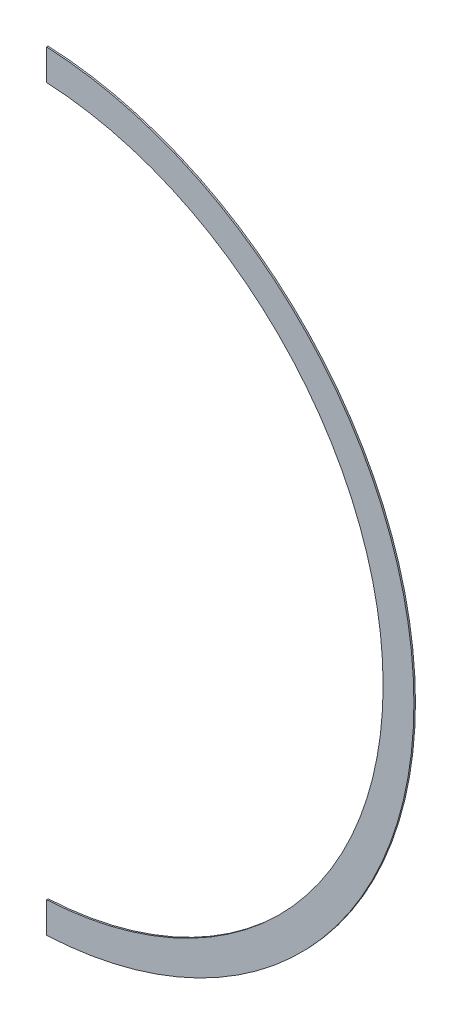
ISO-10303-21;
HEADER;
FILE_DESCRIPTION(('STEP AP214'),'2;1');
FILE_NAME('part.step','',(''),(''),'','','');
FILE_SCHEMA(('AUTOMOTIVE_DESIGN { 1 0 10303 214 1 1 1 1 }'));
ENDSEC;
DATA;
#1=APPLICATION_CONTEXT('core data for automotive mechanical design processes');
#2=APPLICATION_PROTOCOL_DEFINITION('international standard','automotive_design',2000,#1);
#3=PRODUCT_CONTEXT('',#1,'mechanical');
#4=PRODUCT('Part','Part','',(#3));
#5=PRODUCT_RELATED_PRODUCT_CATEGORY('part','',(#4));
#6=PRODUCT_DEFINITION_FORMATION('','',#4);
#7=PRODUCT_DEFINITION_CONTEXT('part definition',#1,'design');
#8=PRODUCT_DEFINITION('design','',#6,#7);
#9=PRODUCT_DEFINITION_SHAPE('','',#8);
#10=(LENGTH_UNIT() NAMED_UNIT(*) SI_UNIT(.MILLI.,.METRE.));
#11=(NAMED_UNIT(*) PLANE_ANGLE_UNIT() SI_UNIT($,.RADIAN.));
#12=(NAMED_UNIT(*) SI_UNIT($,.STERADIAN.) SOLID_ANGLE_UNIT());
#13=UNCERTAINTY_MEASURE_WITH_UNIT(LENGTH_MEASURE(1.E-05),#10,'distance_accuracy_value','');
#14=(GEOMETRIC_REPRESENTATION_CONTEXT(3) GLOBAL_UNCERTAINTY_ASSIGNED_CONTEXT((#13)) GLOBAL_UNIT_ASSIGNED_CONTEXT((#10,
#11,#12)) REPRESENTATION_CONTEXT('',''));
#15=CARTESIAN_POINT('',(0.,0.,0.));
#16=DIRECTION('',(0.,0.,1.));
#17=DIRECTION('',(1.,0.,0.));
#18=AXIS2_PLACEMENT_3D('',#15,#16,#17);
#19=CARTESIAN_POINT('',(0.25,-4.99374608885955,0.750000000000001));
#20=DIRECTION('',(0.,0.,-1.));
#21=DIRECTION('',(-1.,0.,0.));
#22=AXIS2_PLACEMENT_3D('',#19,#20,#21);
#23=CYLINDRICAL_SURFACE('',#22,345.);
#24=CARTESIAN_POINT('',(0.25,-4.99374608885955,-0.749999999999992));
#25=DIRECTION('',(0.,0.,-1.));
#26=DIRECTION('',(1.,0.,0.));
#27=AXIS2_PLACEMENT_3D('',#24,#25,#26);
#28=CIRCLE('',#27,345.);
#29=CARTESIAN_POINT('',(17.5000000000001,339.574734042449,-0.750000000000001));
#30=VERTEX_POINT('',#29);
#31=CARTESIAN_POINT('',(17.5,-349.562226220168,-0.749999999999995));
#32=VERTEX_POINT('',#31);
#33=EDGE_CURVE('E104',#30,#32,#28,.T.);
#34=ORIENTED_EDGE('',*,*,#33,.T.);
#35=DIRECTION('',(0.,0.,-1.));
#36=VECTOR('',#35,1.);
#37=CARTESIAN_POINT('',(17.5000000000001,-349.562226220168,0.749999999999997));
#38=LINE('',#37,#36);
#39=CARTESIAN_POINT('',(17.5000000000001,-349.562226220168,0.749999999999997));
#40=VERTEX_POINT('',#39);
#41=EDGE_CURVE('E11',#40,#32,#38,.T.);
#42=ORIENTED_EDGE('',*,*,#41,.F.);
#43=CARTESIAN_POINT('',(0.25,-4.99374608885955,0.750000000000001));
#44=DIRECTION('',(0.,0.,-1.));
#45=DIRECTION('',(1.,0.,0.));
#46=AXIS2_PLACEMENT_3D('',#43,#44,#45);
#47=CIRCLE('',#46,345.);
#48=CARTESIAN_POINT('',(17.5000000000001,339.574734042449,0.750000000000022));
#49=VERTEX_POINT('',#48);
#50=EDGE_CURVE('E87',#49,#40,#47,.T.);
#51=ORIENTED_EDGE('',*,*,#50,.F.);
#52=DIRECTION('',(0.,0.,-1.));
#53=VECTOR('',#52,1.);
#54=CARTESIAN_POINT('',(17.5000000000001,339.574734042449,0.750000000000022));
#55=LINE('',#54,#53);
#56=EDGE_CURVE('E100',#49,#30,#55,.T.);
#57=ORIENTED_EDGE('',*,*,#56,.T.);
#58=EDGE_LOOP('',(#34,#42,#51,#57));
#59=FACE_BOUND('',#58,.T.);
#60=ADVANCED_FACE('F35',(#59),#23,.F.);
#61=CARTESIAN_POINT('',(17.5,-379.596825592627,0.750000000000004));
#62=DIRECTION('',(1.,0.,0.));
#63=DIRECTION('',(0.,0.,-1.));
#64=AXIS2_PLACEMENT_3D('',#61,#62,#63);
#65=PLANE('',#64);
#66=DIRECTION('',(0.,-0.999999999999999,0.));
#67=VECTOR('',#66,1.);
#68=CARTESIAN_POINT('',(17.5,-379.596825592627,-0.750000000000001));
#69=LINE('',#68,#67);
#70=CARTESIAN_POINT('',(17.5,-379.596825592627,-0.750000000000001));
#71=VERTEX_POINT('',#70);
#72=EDGE_CURVE('E92',#32,#71,#69,.T.);
#73=ORIENTED_EDGE('',*,*,#72,.T.);
#74=DIRECTION('',(0.,0.,-1.));
#75=VECTOR('',#74,1.);
#76=CARTESIAN_POINT('',(17.5,-379.596825592627,0.750000000000004));
#77=LINE('',#76,#75);
#78=CARTESIAN_POINT('',(17.5,-379.596825592627,0.750000000000004));
#79=VERTEX_POINT('',#78);
#80=EDGE_CURVE('E44',#79,#71,#77,.T.);
#81=ORIENTED_EDGE('',*,*,#80,.F.);
#82=DIRECTION('',(0.,-0.999999999999999,0.));
#83=VECTOR('',#82,1.);
#84=CARTESIAN_POINT('',(17.5,-379.596825592627,0.750000000000004));
#85=LINE('',#84,#83);
#86=EDGE_CURVE('E82',#40,#79,#85,.T.);
#87=ORIENTED_EDGE('',*,*,#86,.F.);
#88=ORIENTED_EDGE('',*,*,#41,.T.);
#89=EDGE_LOOP('',(#73,#81,#87,#88));
#90=FACE_BOUND('',#89,.T.);
#91=ADVANCED_FACE('F91',(#90),#65,.F.);
#92=CARTESIAN_POINT('',(0.230263157894733,-4.99469507358702,0.750000000000001));
#93=DIRECTION('',(0.,0.,-1.));
#94=DIRECTION('',(-1.,0.,0.));
#95=AXIS2_PLACEMENT_3D('',#92,#93,#94);
#96=CYLINDRICAL_SURFACE('',#95,375.);
#97=CARTESIAN_POINT('',(0.230263157894733,-4.99469507358702,-0.749999999999992));
#98=DIRECTION('',(0.,0.,1.));
#99=DIRECTION('',(1.,0.,0.));
#100=AXIS2_PLACEMENT_3D('',#97,#98,#99);
#101=CIRCLE('',#100,375.);
#102=CARTESIAN_POINT('',(17.5000000000001,369.607435445454,-0.749999999999995));
#103=VERTEX_POINT('',#102);
#104=EDGE_CURVE('E69',#71,#103,#101,.T.);
#105=ORIENTED_EDGE('',*,*,#104,.T.);
#106=DIRECTION('',(0.,0.,-1.));
#107=VECTOR('',#106,1.);
#108=CARTESIAN_POINT('',(17.5000000000002,369.607435445454,0.750000000000004));
#109=LINE('',#108,#107);
#110=CARTESIAN_POINT('',(17.5000000000002,369.607435445454,0.750000000000004));
#111=VERTEX_POINT('',#110);
#112=EDGE_CURVE('E94',#111,#103,#109,.T.);
#113=ORIENTED_EDGE('',*,*,#112,.F.);
#114=CARTESIAN_POINT('',(0.230263157894733,-4.99469507358702,0.750000000000001));
#115=DIRECTION('',(0.,0.,1.));
#116=DIRECTION('',(1.,0.,0.));
#117=AXIS2_PLACEMENT_3D('',#114,#115,#116);
#118=CIRCLE('',#117,375.);
#119=EDGE_CURVE('E85',#79,#111,#118,.T.);
#120=ORIENTED_EDGE('',*,*,#119,.F.);
#121=ORIENTED_EDGE('',*,*,#80,.T.);
#122=EDGE_LOOP('',(#105,#113,#120,#121));
#123=FACE_BOUND('',#122,.T.);
#124=ADVANCED_FACE('F95',(#123),#96,.T.);
#125=CARTESIAN_POINT('',(17.5000000000001,339.574734042449,0.750000000000022));
#126=DIRECTION('',(1.,0.,0.));
#127=DIRECTION('',(0.,1.,0.));
#128=AXIS2_PLACEMENT_3D('',#125,#126,#127);
#129=PLANE('',#128);
#130=DIRECTION('',(0.,-1.,0.));
#131=VECTOR('',#130,1.);
#132=CARTESIAN_POINT('',(17.5000000000001,339.574734042449,-0.750000000000001));
#133=LINE('',#132,#131);
#134=EDGE_CURVE('E75',#103,#30,#133,.T.);
#135=ORIENTED_EDGE('',*,*,#134,.T.);
#136=ORIENTED_EDGE('',*,*,#56,.F.);
#137=DIRECTION('',(0.,-1.,0.));
#138=VECTOR('',#137,1.);
#139=CARTESIAN_POINT('',(17.5000000000001,339.574734042449,0.750000000000022));
#140=LINE('',#139,#138);
#141=EDGE_CURVE('E52',#111,#49,#140,.T.);
#142=ORIENTED_EDGE('',*,*,#141,.F.);
#143=ORIENTED_EDGE('',*,*,#112,.T.);
#144=EDGE_LOOP('',(#135,#136,#142,#143));
#145=FACE_BOUND('',#144,.T.);
#146=ADVANCED_FACE('F118',(#145),#129,.F.);
#147=CARTESIAN_POINT('',(0.25,-4.99374608885955,0.750000000000001));
#148=DIRECTION('',(0.,0.,1.));
#149=DIRECTION('',(1.,0.,0.));
#150=AXIS2_PLACEMENT_3D('',#147,#148,#149);
#151=PLANE('',#150);
#152=ORIENTED_EDGE('',*,*,#50,.T.);
#153=ORIENTED_EDGE('',*,*,#86,.T.);
#154=ORIENTED_EDGE('',*,*,#119,.T.);
#155=ORIENTED_EDGE('',*,*,#141,.T.);
#156=EDGE_LOOP('',(#152,#153,#154,#155));
#157=FACE_BOUND('',#156,.T.);
#158=ADVANCED_FACE('F83',(#157),#151,.T.);
#159=CARTESIAN_POINT('',(0.25,-4.99374608885955,-0.749999999999992));
#160=DIRECTION('',(0.,0.,1.));
#161=DIRECTION('',(1.,0.,0.));
#162=AXIS2_PLACEMENT_3D('',#159,#160,#161);
#163=PLANE('',#162);
#164=ORIENTED_EDGE('',*,*,#33,.F.);
#165=ORIENTED_EDGE('',*,*,#134,.F.);
#166=ORIENTED_EDGE('',*,*,#104,.F.);
#167=ORIENTED_EDGE('',*,*,#72,.F.);
#168=EDGE_LOOP('',(#164,#165,#166,#167));
#169=FACE_BOUND('',#168,.T.);
#170=ADVANCED_FACE('F121',(#169),#163,.F.);
#171=CLOSED_SHELL('',(#60,#91,#124,#146,#158,#170));
#172=MANIFOLD_SOLID_BREP('B2',#171);
#173=ADVANCED_BREP_SHAPE_REPRESENTATION('',(#18,#172),#14);
#174=SHAPE_DEFINITION_REPRESENTATION(#9,#173);
ENDSEC;
END-ISO-10303-21;
